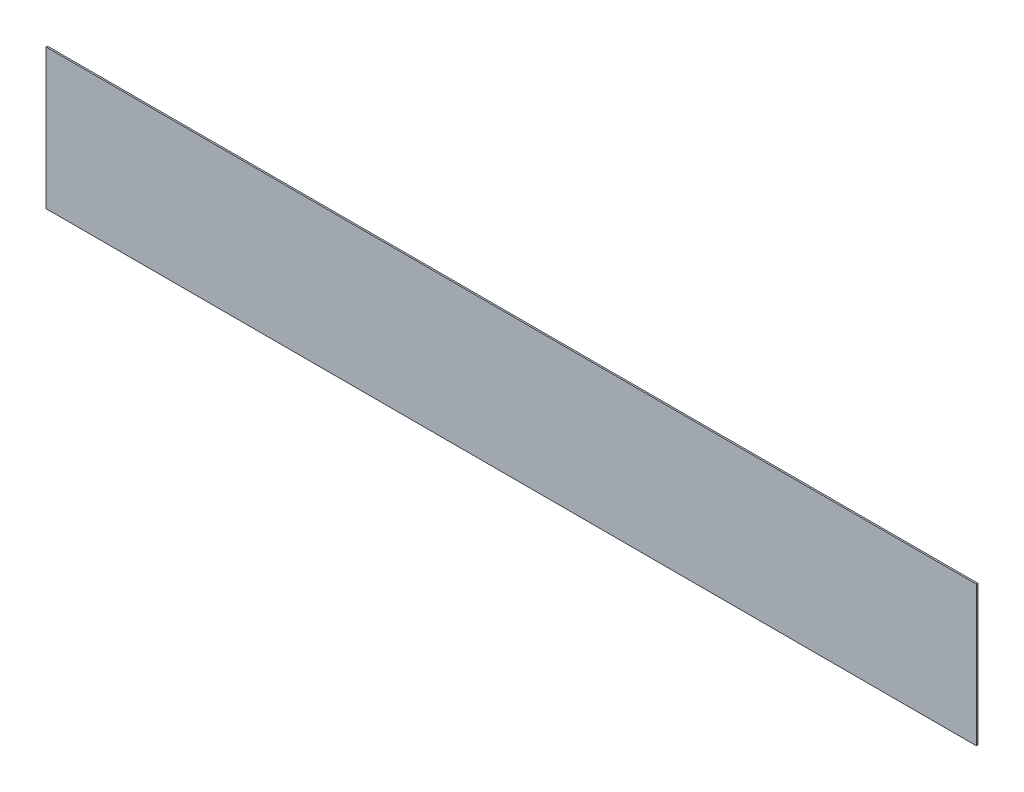
ISO-10303-21;
HEADER;
FILE_DESCRIPTION(('STEP AP214'),'2;1');
FILE_NAME('part.step','',(''),(''),'','','');
FILE_SCHEMA(('AUTOMOTIVE_DESIGN { 1 0 10303 214 1 1 1 1 }'));
ENDSEC;
DATA;
#1=APPLICATION_CONTEXT('core data for automotive mechanical design processes');
#2=APPLICATION_PROTOCOL_DEFINITION('international standard','automotive_design',2000,#1);
#3=PRODUCT_CONTEXT('',#1,'mechanical');
#4=PRODUCT('Part','Part','',(#3));
#5=PRODUCT_RELATED_PRODUCT_CATEGORY('part','',(#4));
#6=PRODUCT_DEFINITION_FORMATION('','',#4);
#7=PRODUCT_DEFINITION_CONTEXT('part definition',#1,'design');
#8=PRODUCT_DEFINITION('design','',#6,#7);
#9=PRODUCT_DEFINITION_SHAPE('','',#8);
#10=(LENGTH_UNIT() NAMED_UNIT(*) SI_UNIT(.MILLI.,.METRE.));
#11=(NAMED_UNIT(*) PLANE_ANGLE_UNIT() SI_UNIT($,.RADIAN.));
#12=(NAMED_UNIT(*) SI_UNIT($,.STERADIAN.) SOLID_ANGLE_UNIT());
#13=UNCERTAINTY_MEASURE_WITH_UNIT(LENGTH_MEASURE(1.E-05),#10,'distance_accuracy_value','');
#14=(GEOMETRIC_REPRESENTATION_CONTEXT(3) GLOBAL_UNCERTAINTY_ASSIGNED_CONTEXT((#13)) GLOBAL_UNIT_ASSIGNED_CONTEXT((#10,
#11,#12)) REPRESENTATION_CONTEXT('',''));
#15=CARTESIAN_POINT('',(0.,0.,0.));
#16=DIRECTION('',(0.,0.,1.));
#17=DIRECTION('',(1.,0.,0.));
#18=AXIS2_PLACEMENT_3D('',#15,#16,#17);
#19=CARTESIAN_POINT('',(0.,0.,1.));
#20=DIRECTION('',(1.,0.,0.));
#21=DIRECTION('',(0.,0.,-1.));
#22=AXIS2_PLACEMENT_3D('',#19,#20,#21);
#23=PLANE('',#22);
#24=DIRECTION('',(0.,-1.,0.));
#25=VECTOR('',#24,1.);
#26=CARTESIAN_POINT('',(0.,0.,0.));
#27=LINE('',#26,#25);
#28=CARTESIAN_POINT('',(0.,93.,0.));
#29=VERTEX_POINT('',#28);
#30=CARTESIAN_POINT('',(0.,0.,0.));
#31=VERTEX_POINT('',#30);
#32=EDGE_CURVE('E102',#29,#31,#27,.T.);
#33=ORIENTED_EDGE('',*,*,#32,.T.);
#34=DIRECTION('',(0.,0.,-1.));
#35=VECTOR('',#34,1.);
#36=CARTESIAN_POINT('',(0.,0.,1.));
#37=LINE('',#36,#35);
#38=CARTESIAN_POINT('',(0.,0.,1.));
#39=VERTEX_POINT('',#38);
#40=EDGE_CURVE('E11',#39,#31,#37,.T.);
#41=ORIENTED_EDGE('',*,*,#40,.F.);
#42=DIRECTION('',(0.,-1.,0.));
#43=VECTOR('',#42,1.);
#44=CARTESIAN_POINT('',(0.,0.,1.));
#45=LINE('',#44,#43);
#46=CARTESIAN_POINT('',(0.,93.,1.));
#47=VERTEX_POINT('',#46);
#48=EDGE_CURVE('E90',#47,#39,#45,.T.);
#49=ORIENTED_EDGE('',*,*,#48,.F.);
#50=DIRECTION('',(0.,0.,-1.));
#51=VECTOR('',#50,1.);
#52=CARTESIAN_POINT('',(0.,93.,1.));
#53=LINE('',#52,#51);
#54=EDGE_CURVE('E98',#47,#29,#53,.T.);
#55=ORIENTED_EDGE('',*,*,#54,.T.);
#56=EDGE_LOOP('',(#33,#41,#49,#55));
#57=FACE_BOUND('',#56,.T.);
#58=ADVANCED_FACE('F39',(#57),#23,.F.);
#59=CARTESIAN_POINT('',(0.,0.,1.));
#60=DIRECTION('',(0.,1.,0.));
#61=DIRECTION('',(0.,0.,1.));
#62=AXIS2_PLACEMENT_3D('',#59,#60,#61);
#63=PLANE('',#62);
#64=DIRECTION('',(1.,0.,0.));
#65=VECTOR('',#64,1.);
#66=CARTESIAN_POINT('',(0.,0.,0.));
#67=LINE('',#66,#65);
#68=CARTESIAN_POINT('',(618.,0.,0.));
#69=VERTEX_POINT('',#68);
#70=EDGE_CURVE('E94',#31,#69,#67,.T.);
#71=ORIENTED_EDGE('',*,*,#70,.T.);
#72=DIRECTION('',(0.,0.,-1.));
#73=VECTOR('',#72,1.);
#74=CARTESIAN_POINT('',(618.,0.,1.));
#75=LINE('',#74,#73);
#76=CARTESIAN_POINT('',(618.,0.,1.));
#77=VERTEX_POINT('',#76);
#78=EDGE_CURVE('E47',#77,#69,#75,.T.);
#79=ORIENTED_EDGE('',*,*,#78,.F.);
#80=DIRECTION('',(1.,0.,0.));
#81=VECTOR('',#80,1.);
#82=CARTESIAN_POINT('',(0.,0.,1.));
#83=LINE('',#82,#81);
#84=EDGE_CURVE('E85',#39,#77,#83,.T.);
#85=ORIENTED_EDGE('',*,*,#84,.F.);
#86=ORIENTED_EDGE('',*,*,#40,.T.);
#87=EDGE_LOOP('',(#71,#79,#85,#86));
#88=FACE_BOUND('',#87,.T.);
#89=ADVANCED_FACE('F93',(#88),#63,.F.);
#90=CARTESIAN_POINT('',(618.,0.,1.));
#91=DIRECTION('',(-1.,0.,0.));
#92=DIRECTION('',(0.,0.,1.));
#93=AXIS2_PLACEMENT_3D('',#90,#91,#92);
#94=PLANE('',#93);
#95=DIRECTION('',(0.,1.,0.));
#96=VECTOR('',#95,1.);
#97=CARTESIAN_POINT('',(618.,0.,0.));
#98=LINE('',#97,#96);
#99=CARTESIAN_POINT('',(618.,93.,0.));
#100=VERTEX_POINT('',#99);
#101=EDGE_CURVE('E72',#69,#100,#98,.T.);
#102=ORIENTED_EDGE('',*,*,#101,.T.);
#103=DIRECTION('',(0.,0.,-1.));
#104=VECTOR('',#103,1.);
#105=CARTESIAN_POINT('',(618.,93.,1.));
#106=LINE('',#105,#104);
#107=CARTESIAN_POINT('',(618.,93.,1.));
#108=VERTEX_POINT('',#107);
#109=EDGE_CURVE('E95',#108,#100,#106,.T.);
#110=ORIENTED_EDGE('',*,*,#109,.F.);
#111=DIRECTION('',(0.,1.,0.));
#112=VECTOR('',#111,1.);
#113=CARTESIAN_POINT('',(618.,0.,1.));
#114=LINE('',#113,#112);
#115=EDGE_CURVE('E88',#77,#108,#114,.T.);
#116=ORIENTED_EDGE('',*,*,#115,.F.);
#117=ORIENTED_EDGE('',*,*,#78,.T.);
#118=EDGE_LOOP('',(#102,#110,#116,#117));
#119=FACE_BOUND('',#118,.T.);
#120=ADVANCED_FACE('F96',(#119),#94,.F.);
#121=CARTESIAN_POINT('',(0.,93.,1.));
#122=DIRECTION('',(0.,-1.,0.));
#123=DIRECTION('',(0.,0.,-1.));
#124=AXIS2_PLACEMENT_3D('',#121,#122,#123);
#125=PLANE('',#124);
#126=DIRECTION('',(-1.,0.,0.));
#127=VECTOR('',#126,1.);
#128=CARTESIAN_POINT('',(0.,93.,0.));
#129=LINE('',#128,#127);
#130=EDGE_CURVE('E78',#100,#29,#129,.T.);
#131=ORIENTED_EDGE('',*,*,#130,.T.);
#132=ORIENTED_EDGE('',*,*,#54,.F.);
#133=DIRECTION('',(-1.,0.,0.));
#134=VECTOR('',#133,1.);
#135=CARTESIAN_POINT('',(0.,93.,1.));
#136=LINE('',#135,#134);
#137=EDGE_CURVE('E55',#108,#47,#136,.T.);
#138=ORIENTED_EDGE('',*,*,#137,.F.);
#139=ORIENTED_EDGE('',*,*,#109,.T.);
#140=EDGE_LOOP('',(#131,#132,#138,#139));
#141=FACE_BOUND('',#140,.T.);
#142=ADVANCED_FACE('F109',(#141),#125,.F.);
#143=CARTESIAN_POINT('',(0.,0.,1.));
#144=DIRECTION('',(0.,0.,-1.));
#145=DIRECTION('',(-1.,0.,0.));
#146=AXIS2_PLACEMENT_3D('',#143,#144,#145);
#147=PLANE('',#146);
#148=ORIENTED_EDGE('',*,*,#48,.T.);
#149=ORIENTED_EDGE('',*,*,#84,.T.);
#150=ORIENTED_EDGE('',*,*,#115,.T.);
#151=ORIENTED_EDGE('',*,*,#137,.T.);
#152=EDGE_LOOP('',(#148,#149,#150,#151));
#153=FACE_BOUND('',#152,.T.);
#154=ADVANCED_FACE('F86',(#153),#147,.F.);
#155=CARTESIAN_POINT('',(0.,0.,0.));
#156=DIRECTION('',(0.,0.,-1.));
#157=DIRECTION('',(-1.,0.,0.));
#158=AXIS2_PLACEMENT_3D('',#155,#156,#157);
#159=PLANE('',#158);
#160=ORIENTED_EDGE('',*,*,#32,.F.);
#161=ORIENTED_EDGE('',*,*,#130,.F.);
#162=ORIENTED_EDGE('',*,*,#101,.F.);
#163=ORIENTED_EDGE('',*,*,#70,.F.);
#164=EDGE_LOOP('',(#160,#161,#162,#163));
#165=FACE_BOUND('',#164,.T.);
#166=ADVANCED_FACE('F112',(#165),#159,.T.);
#167=CLOSED_SHELL('',(#58,#89,#120,#142,#154,#166));
#168=MANIFOLD_SOLID_BREP('B2',#167);
#169=ADVANCED_BREP_SHAPE_REPRESENTATION('',(#18,#168),#14);
#170=SHAPE_DEFINITION_REPRESENTATION(#9,#169);
ENDSEC;
END-ISO-10303-21;
